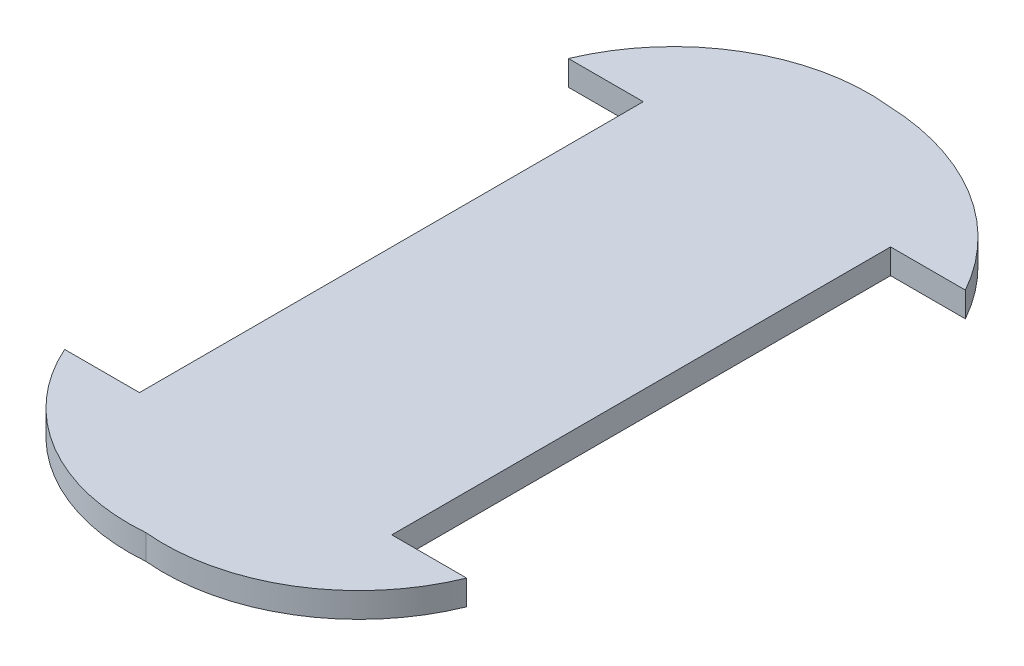
ISO-10303-21;
HEADER;
FILE_DESCRIPTION(('STEP AP214'),'2;1');
FILE_NAME('part.step','',(''),(''),'','','');
FILE_SCHEMA(('AUTOMOTIVE_DESIGN { 1 0 10303 214 1 1 1 1 }'));
ENDSEC;
DATA;
#1=APPLICATION_CONTEXT('core data for automotive mechanical design processes');
#2=APPLICATION_PROTOCOL_DEFINITION('international standard','automotive_design',2000,#1);
#3=PRODUCT_CONTEXT('',#1,'mechanical');
#4=PRODUCT('Part','Part','',(#3));
#5=PRODUCT_RELATED_PRODUCT_CATEGORY('part','',(#4));
#6=PRODUCT_DEFINITION_FORMATION('','',#4);
#7=PRODUCT_DEFINITION_CONTEXT('part definition',#1,'design');
#8=PRODUCT_DEFINITION('design','',#6,#7);
#9=PRODUCT_DEFINITION_SHAPE('','',#8);
#10=(LENGTH_UNIT() NAMED_UNIT(*) SI_UNIT(.MILLI.,.METRE.));
#11=(NAMED_UNIT(*) PLANE_ANGLE_UNIT() SI_UNIT($,.RADIAN.));
#12=(NAMED_UNIT(*) SI_UNIT($,.STERADIAN.) SOLID_ANGLE_UNIT());
#13=UNCERTAINTY_MEASURE_WITH_UNIT(LENGTH_MEASURE(1.E-05),#10,'distance_accuracy_value','');
#14=(GEOMETRIC_REPRESENTATION_CONTEXT(3) GLOBAL_UNCERTAINTY_ASSIGNED_CONTEXT((#13)) GLOBAL_UNIT_ASSIGNED_CONTEXT((#10,
#11,#12)) REPRESENTATION_CONTEXT('',''));
#15=CARTESIAN_POINT('',(0.,0.,0.));
#16=DIRECTION('',(0.,0.,1.));
#17=DIRECTION('',(1.,0.,0.));
#18=AXIS2_PLACEMENT_3D('',#15,#16,#17);
#19=CARTESIAN_POINT('',(50.,10.,-100.));
#20=DIRECTION('',(0.,0.,-1.));
#21=DIRECTION('',(-1.,0.,0.));
#22=AXIS2_PLACEMENT_3D('',#19,#20,#21);
#23=PLANE('',#22);
#24=DIRECTION('',(1.,0.,0.));
#25=VECTOR('',#24,1.);
#26=CARTESIAN_POINT('',(50.,0.,-100.));
#27=LINE('',#26,#25);
#28=CARTESIAN_POINT('',(50.,0.,-100.));
#29=VERTEX_POINT('',#28);
#30=CARTESIAN_POINT('',(80.,0.,-100.));
#31=VERTEX_POINT('',#30);
#32=EDGE_CURVE('E141',#29,#31,#27,.T.);
#33=ORIENTED_EDGE('',*,*,#32,.T.);
#34=DIRECTION('',(0.,-1.,0.));
#35=VECTOR('',#34,1.);
#36=CARTESIAN_POINT('',(80.,10.,-100.));
#37=LINE('',#36,#35);
#38=CARTESIAN_POINT('',(80.,10.,-100.));
#39=VERTEX_POINT('',#38);
#40=EDGE_CURVE('E11',#39,#31,#37,.T.);
#41=ORIENTED_EDGE('',*,*,#40,.F.);
#42=DIRECTION('',(1.,0.,0.));
#43=VECTOR('',#42,1.);
#44=CARTESIAN_POINT('',(50.,10.,-100.));
#45=LINE('',#44,#43);
#46=CARTESIAN_POINT('',(50.,10.,-100.));
#47=VERTEX_POINT('',#46);
#48=EDGE_CURVE('E159',#47,#39,#45,.T.);
#49=ORIENTED_EDGE('',*,*,#48,.F.);
#50=DIRECTION('',(0.,-1.,0.));
#51=VECTOR('',#50,1.);
#52=CARTESIAN_POINT('',(50.,10.,-100.));
#53=LINE('',#52,#51);
#54=EDGE_CURVE('E137',#47,#29,#53,.T.);
#55=ORIENTED_EDGE('',*,*,#54,.T.);
#56=EDGE_LOOP('',(#33,#41,#49,#55));
#57=FACE_BOUND('',#56,.T.);
#58=ADVANCED_FACE('F33',(#57),#23,.F.);
#59=CARTESIAN_POINT('',(-2.78424386794476,10.,-53.7669049189763));
#60=DIRECTION('',(0.,-1.,0.));
#61=DIRECTION('',(0.,0.,-1.));
#62=AXIS2_PLACEMENT_3D('',#59,#60,#61);
#63=CYLINDRICAL_SURFACE('',#62,94.8194606268056);
#64=CARTESIAN_POINT('',(-2.78424386794476,0.,-53.7669049189763));
#65=DIRECTION('',(0.,1.,0.));
#66=DIRECTION('',(0.,0.,-1.));
#67=AXIS2_PLACEMENT_3D('',#64,#65,#66);
#68=CIRCLE('',#67,94.8194606268056);
#69=CARTESIAN_POINT('',(0.795654444108916,0.,-148.518762112562));
#70=VERTEX_POINT('',#69);
#71=EDGE_CURVE('E144',#31,#70,#68,.T.);
#72=ORIENTED_EDGE('',*,*,#71,.T.);
#73=DIRECTION('',(0.,-1.,0.));
#74=VECTOR('',#73,1.);
#75=CARTESIAN_POINT('',(0.795654444108916,10.,-148.518762112562));
#76=LINE('',#75,#74);
#77=CARTESIAN_POINT('',(0.795654444108916,10.,-148.518762112562));
#78=VERTEX_POINT('',#77);
#79=EDGE_CURVE('E41',#78,#70,#76,.T.);
#80=ORIENTED_EDGE('',*,*,#79,.F.);
#81=CARTESIAN_POINT('',(-2.78424386794476,10.,-53.7669049189763));
#82=DIRECTION('',(0.,1.,0.));
#83=DIRECTION('',(0.,0.,-1.));
#84=AXIS2_PLACEMENT_3D('',#81,#82,#83);
#85=CIRCLE('',#84,94.8194606268056);
#86=EDGE_CURVE('E98',#39,#78,#85,.T.);
#87=ORIENTED_EDGE('',*,*,#86,.F.);
#88=ORIENTED_EDGE('',*,*,#40,.T.);
#89=EDGE_LOOP('',(#72,#80,#87,#88));
#90=FACE_BOUND('',#89,.T.);
#91=ADVANCED_FACE('F208',(#90),#63,.T.);
#92=CARTESIAN_POINT('',(-7.68306068778015,10.,-70.5939807091649));
#93=DIRECTION('',(0.,-1.,0.));
#94=DIRECTION('',(0.,0.,-1.));
#95=AXIS2_PLACEMENT_3D('',#92,#93,#94);
#96=CYLINDRICAL_SURFACE('',#95,78.384693448753);
#97=CARTESIAN_POINT('',(-7.68306068778015,0.,-70.5939807091649));
#98=DIRECTION('',(0.,1.,0.));
#99=DIRECTION('',(0.,0.,-1.));
#100=AXIS2_PLACEMENT_3D('',#97,#98,#99);
#101=CIRCLE('',#100,78.384693448753);
#102=CARTESIAN_POINT('',(-80.,0.,-100.833366542341));
#103=VERTEX_POINT('',#102);
#104=EDGE_CURVE('E146',#70,#103,#101,.T.);
#105=ORIENTED_EDGE('',*,*,#104,.T.);
#106=DIRECTION('',(0.,-1.,0.));
#107=VECTOR('',#106,1.);
#108=CARTESIAN_POINT('',(-80.,10.,-100.833366542341));
#109=LINE('',#108,#107);
#110=CARTESIAN_POINT('',(-80.,10.,-100.833366542341));
#111=VERTEX_POINT('',#110);
#112=EDGE_CURVE('E172',#111,#103,#109,.T.);
#113=ORIENTED_EDGE('',*,*,#112,.F.);
#114=CARTESIAN_POINT('',(-7.68306068778015,10.,-70.5939807091649));
#115=DIRECTION('',(0.,1.,0.));
#116=DIRECTION('',(0.,0.,-1.));
#117=AXIS2_PLACEMENT_3D('',#114,#115,#116);
#118=CIRCLE('',#117,78.384693448753);
#119=EDGE_CURVE('E180',#78,#111,#118,.T.);
#120=ORIENTED_EDGE('',*,*,#119,.F.);
#121=ORIENTED_EDGE('',*,*,#79,.T.);
#122=EDGE_LOOP('',(#105,#113,#120,#121));
#123=FACE_BOUND('',#122,.T.);
#124=ADVANCED_FACE('F178',(#123),#96,.T.);
#125=CARTESIAN_POINT('',(-50.,10.,-100.833366542341));
#126=DIRECTION('',(0.,0.,-1.));
#127=DIRECTION('',(-1.,0.,0.));
#128=AXIS2_PLACEMENT_3D('',#125,#126,#127);
#129=PLANE('',#128);
#130=DIRECTION('',(1.,0.,0.));
#131=VECTOR('',#130,1.);
#132=CARTESIAN_POINT('',(-50.,0.,-100.833366542341));
#133=LINE('',#132,#131);
#134=CARTESIAN_POINT('',(-50.,0.,-100.833366542341));
#135=VERTEX_POINT('',#134);
#136=EDGE_CURVE('E148',#103,#135,#133,.T.);
#137=ORIENTED_EDGE('',*,*,#136,.T.);
#138=DIRECTION('',(0.,-1.,0.));
#139=VECTOR('',#138,1.);
#140=CARTESIAN_POINT('',(-50.,10.,-100.833366542341));
#141=LINE('',#140,#139);
#142=CARTESIAN_POINT('',(-50.,10.,-100.833366542341));
#143=VERTEX_POINT('',#142);
#144=EDGE_CURVE('E169',#143,#135,#141,.T.);
#145=ORIENTED_EDGE('',*,*,#144,.F.);
#146=DIRECTION('',(1.,0.,0.));
#147=VECTOR('',#146,1.);
#148=CARTESIAN_POINT('',(-50.,10.,-100.833366542341));
#149=LINE('',#148,#147);
#150=EDGE_CURVE('E198',#111,#143,#149,.T.);
#151=ORIENTED_EDGE('',*,*,#150,.F.);
#152=ORIENTED_EDGE('',*,*,#112,.T.);
#153=EDGE_LOOP('',(#137,#145,#151,#152));
#154=FACE_BOUND('',#153,.T.);
#155=ADVANCED_FACE('F189',(#154),#129,.F.);
#156=CARTESIAN_POINT('',(-50.,10.,101.182229898701));
#157=DIRECTION('',(1.,0.,0.));
#158=DIRECTION('',(0.,0.,-1.));
#159=AXIS2_PLACEMENT_3D('',#156,#157,#158);
#160=PLANE('',#159);
#161=DIRECTION('',(0.,0.,1.));
#162=VECTOR('',#161,1.);
#163=CARTESIAN_POINT('',(-50.,0.,101.182229898701));
#164=LINE('',#163,#162);
#165=CARTESIAN_POINT('',(-50.,0.,101.182229898701));
#166=VERTEX_POINT('',#165);
#167=EDGE_CURVE('E150',#135,#166,#164,.T.);
#168=ORIENTED_EDGE('',*,*,#167,.T.);
#169=DIRECTION('',(0.,-1.,0.));
#170=VECTOR('',#169,1.);
#171=CARTESIAN_POINT('',(-50.,10.,101.182229898701));
#172=LINE('',#171,#170);
#173=CARTESIAN_POINT('',(-50.,10.,101.182229898701));
#174=VERTEX_POINT('',#173);
#175=EDGE_CURVE('E166',#174,#166,#172,.T.);
#176=ORIENTED_EDGE('',*,*,#175,.F.);
#177=DIRECTION('',(0.,0.,1.));
#178=VECTOR('',#177,1.);
#179=CARTESIAN_POINT('',(-50.,10.,101.182229898701));
#180=LINE('',#179,#178);
#181=EDGE_CURVE('E195',#143,#174,#180,.T.);
#182=ORIENTED_EDGE('',*,*,#181,.F.);
#183=ORIENTED_EDGE('',*,*,#144,.T.);
#184=EDGE_LOOP('',(#168,#176,#182,#183));
#185=FACE_BOUND('',#184,.T.);
#186=ADVANCED_FACE('F193',(#185),#160,.F.);
#187=CARTESIAN_POINT('',(-80.,10.,101.182229898701));
#188=DIRECTION('',(0.,0.,1.));
#189=DIRECTION('',(1.,0.,0.));
#190=AXIS2_PLACEMENT_3D('',#187,#188,#189);
#191=PLANE('',#190);
#192=DIRECTION('',(-1.,0.,0.));
#193=VECTOR('',#192,1.);
#194=CARTESIAN_POINT('',(-80.,0.,101.182229898701));
#195=LINE('',#194,#193);
#196=CARTESIAN_POINT('',(-80.,0.,101.182229898701));
#197=VERTEX_POINT('',#196);
#198=EDGE_CURVE('E152',#166,#197,#195,.T.);
#199=ORIENTED_EDGE('',*,*,#198,.T.);
#200=DIRECTION('',(0.,-1.,0.));
#201=VECTOR('',#200,1.);
#202=CARTESIAN_POINT('',(-80.,10.,101.182229898701));
#203=LINE('',#202,#201);
#204=CARTESIAN_POINT('',(-80.,10.,101.182229898701));
#205=VERTEX_POINT('',#204);
#206=EDGE_CURVE('E163',#205,#197,#203,.T.);
#207=ORIENTED_EDGE('',*,*,#206,.F.);
#208=DIRECTION('',(-1.,0.,0.));
#209=VECTOR('',#208,1.);
#210=CARTESIAN_POINT('',(-80.,10.,101.182229898701));
#211=LINE('',#210,#209);
#212=EDGE_CURVE('E197',#174,#205,#211,.T.);
#213=ORIENTED_EDGE('',*,*,#212,.F.);
#214=ORIENTED_EDGE('',*,*,#175,.T.);
#215=EDGE_LOOP('',(#199,#207,#213,#214));
#216=FACE_BOUND('',#215,.T.);
#217=ADVANCED_FACE('F220',(#216),#191,.F.);
#218=CARTESIAN_POINT('',(-6.57333167833926,10.,68.3775635833274));
#219=DIRECTION('',(0.,-1.,0.));
#220=DIRECTION('',(0.,0.,-1.));
#221=AXIS2_PLACEMENT_3D('',#218,#219,#220);
#222=CYLINDRICAL_SURFACE('',#221,80.42152543245);
#223=CARTESIAN_POINT('',(-6.57333167833926,0.,68.3775635833274));
#224=DIRECTION('',(0.,1.,0.));
#225=DIRECTION('',(0.,0.,-1.));
#226=AXIS2_PLACEMENT_3D('',#223,#224,#225);
#227=CIRCLE('',#226,80.42152543245);
#228=CARTESIAN_POINT('',(0.,0.,148.53));
#229=VERTEX_POINT('',#228);
#230=EDGE_CURVE('E154',#197,#229,#227,.T.);
#231=ORIENTED_EDGE('',*,*,#230,.T.);
#232=DIRECTION('',(0.,-1.,0.));
#233=VECTOR('',#232,1.);
#234=CARTESIAN_POINT('',(0.,10.,148.53));
#235=LINE('',#234,#233);
#236=CARTESIAN_POINT('',(0.,10.,148.53));
#237=VERTEX_POINT('',#236);
#238=EDGE_CURVE('E132',#237,#229,#235,.T.);
#239=ORIENTED_EDGE('',*,*,#238,.F.);
#240=CARTESIAN_POINT('',(-6.57333167833926,10.,68.3775635833274));
#241=DIRECTION('',(0.,1.,0.));
#242=DIRECTION('',(0.,0.,-1.));
#243=AXIS2_PLACEMENT_3D('',#240,#241,#242);
#244=CIRCLE('',#243,80.42152543245);
#245=EDGE_CURVE('E123',#205,#237,#244,.T.);
#246=ORIENTED_EDGE('',*,*,#245,.F.);
#247=ORIENTED_EDGE('',*,*,#206,.T.);
#248=EDGE_LOOP('',(#231,#239,#246,#247));
#249=FACE_BOUND('',#248,.T.);
#250=ADVANCED_FACE('F223',(#249),#222,.T.);
#251=CARTESIAN_POINT('',(7.38091459539411,10.,70.4935837138168));
#252=DIRECTION('',(0.,-1.,0.));
#253=DIRECTION('',(0.,0.,-1.));
#254=AXIS2_PLACEMENT_3D('',#251,#252,#253);
#255=CYLINDRICAL_SURFACE('',#254,78.384693448753);
#256=CARTESIAN_POINT('',(7.38091459539411,0.,70.4935837138168));
#257=DIRECTION('',(0.,1.,0.));
#258=DIRECTION('',(0.,0.,-1.));
#259=AXIS2_PLACEMENT_3D('',#256,#257,#258);
#260=CIRCLE('',#259,78.384693448753);
#261=CARTESIAN_POINT('',(80.,0.,100.));
#262=VERTEX_POINT('',#261);
#263=EDGE_CURVE('E131',#229,#262,#260,.T.);
#264=ORIENTED_EDGE('',*,*,#263,.T.);
#265=DIRECTION('',(0.,-1.,0.));
#266=VECTOR('',#265,1.);
#267=CARTESIAN_POINT('',(80.,10.,100.));
#268=LINE('',#267,#266);
#269=CARTESIAN_POINT('',(80.,10.,100.));
#270=VERTEX_POINT('',#269);
#271=EDGE_CURVE('E128',#270,#262,#268,.T.);
#272=ORIENTED_EDGE('',*,*,#271,.F.);
#273=CARTESIAN_POINT('',(7.38091459539411,10.,70.4935837138168));
#274=DIRECTION('',(0.,1.,0.));
#275=DIRECTION('',(0.,0.,-1.));
#276=AXIS2_PLACEMENT_3D('',#273,#274,#275);
#277=CIRCLE('',#276,78.384693448753);
#278=EDGE_CURVE('E117',#237,#270,#277,.T.);
#279=ORIENTED_EDGE('',*,*,#278,.F.);
#280=ORIENTED_EDGE('',*,*,#238,.T.);
#281=EDGE_LOOP('',(#264,#272,#279,#280));
#282=FACE_BOUND('',#281,.T.);
#283=ADVANCED_FACE('F129',(#282),#255,.T.);
#284=CARTESIAN_POINT('',(50.,10.,100.));
#285=DIRECTION('',(0.,0.,1.));
#286=DIRECTION('',(1.,0.,0.));
#287=AXIS2_PLACEMENT_3D('',#284,#285,#286);
#288=PLANE('',#287);
#289=DIRECTION('',(-1.,0.,0.));
#290=VECTOR('',#289,1.);
#291=CARTESIAN_POINT('',(50.,0.,100.));
#292=LINE('',#291,#290);
#293=CARTESIAN_POINT('',(50.,0.,100.));
#294=VERTEX_POINT('',#293);
#295=EDGE_CURVE('E84',#262,#294,#292,.T.);
#296=ORIENTED_EDGE('',*,*,#295,.T.);
#297=DIRECTION('',(0.,-1.,0.));
#298=VECTOR('',#297,1.);
#299=CARTESIAN_POINT('',(50.,10.,100.));
#300=LINE('',#299,#298);
#301=CARTESIAN_POINT('',(50.,10.,100.));
#302=VERTEX_POINT('',#301);
#303=EDGE_CURVE('E133',#302,#294,#300,.T.);
#304=ORIENTED_EDGE('',*,*,#303,.F.);
#305=DIRECTION('',(-1.,0.,0.));
#306=VECTOR('',#305,1.);
#307=CARTESIAN_POINT('',(50.,10.,100.));
#308=LINE('',#307,#306);
#309=EDGE_CURVE('E121',#270,#302,#308,.T.);
#310=ORIENTED_EDGE('',*,*,#309,.F.);
#311=ORIENTED_EDGE('',*,*,#271,.T.);
#312=EDGE_LOOP('',(#296,#304,#310,#311));
#313=FACE_BOUND('',#312,.T.);
#314=ADVANCED_FACE('F135',(#313),#288,.F.);
#315=CARTESIAN_POINT('',(50.,10.,-100.));
#316=DIRECTION('',(-1.,0.,0.));
#317=DIRECTION('',(0.,0.,1.));
#318=AXIS2_PLACEMENT_3D('',#315,#316,#317);
#319=PLANE('',#318);
#320=DIRECTION('',(0.,0.,-1.));
#321=VECTOR('',#320,1.);
#322=CARTESIAN_POINT('',(50.,0.,-100.));
#323=LINE('',#322,#321);
#324=EDGE_CURVE('E90',#294,#29,#323,.T.);
#325=ORIENTED_EDGE('',*,*,#324,.T.);
#326=ORIENTED_EDGE('',*,*,#54,.F.);
#327=DIRECTION('',(0.,0.,-1.));
#328=VECTOR('',#327,1.);
#329=CARTESIAN_POINT('',(50.,10.,-100.));
#330=LINE('',#329,#328);
#331=EDGE_CURVE('E49',#302,#47,#330,.T.);
#332=ORIENTED_EDGE('',*,*,#331,.F.);
#333=ORIENTED_EDGE('',*,*,#303,.T.);
#334=EDGE_LOOP('',(#325,#326,#332,#333));
#335=FACE_BOUND('',#334,.T.);
#336=ADVANCED_FACE('F232',(#335),#319,.F.);
#337=CARTESIAN_POINT('',(-2.78424386794476,10.,-53.7669049189763));
#338=DIRECTION('',(0.,-1.,0.));
#339=DIRECTION('',(0.,0.,-1.));
#340=AXIS2_PLACEMENT_3D('',#337,#338,#339);
#341=PLANE('',#340);
#342=ORIENTED_EDGE('',*,*,#48,.T.);
#343=ORIENTED_EDGE('',*,*,#86,.T.);
#344=ORIENTED_EDGE('',*,*,#119,.T.);
#345=ORIENTED_EDGE('',*,*,#150,.T.);
#346=ORIENTED_EDGE('',*,*,#181,.T.);
#347=ORIENTED_EDGE('',*,*,#212,.T.);
#348=ORIENTED_EDGE('',*,*,#245,.T.);
#349=ORIENTED_EDGE('',*,*,#278,.T.);
#350=ORIENTED_EDGE('',*,*,#309,.T.);
#351=ORIENTED_EDGE('',*,*,#331,.T.);
#352=EDGE_LOOP('',(#342,#343,#344,#345,#346,#347,#348,#349,#350,#351));
#353=FACE_BOUND('',#352,.T.);
#354=ADVANCED_FACE('F119',(#353),#341,.F.);
#355=CARTESIAN_POINT('',(-2.78424386794476,0.,-53.7669049189763));
#356=DIRECTION('',(0.,-1.,0.));
#357=DIRECTION('',(0.,0.,-1.));
#358=AXIS2_PLACEMENT_3D('',#355,#356,#357);
#359=PLANE('',#358);
#360=ORIENTED_EDGE('',*,*,#32,.F.);
#361=ORIENTED_EDGE('',*,*,#324,.F.);
#362=ORIENTED_EDGE('',*,*,#295,.F.);
#363=ORIENTED_EDGE('',*,*,#263,.F.);
#364=ORIENTED_EDGE('',*,*,#230,.F.);
#365=ORIENTED_EDGE('',*,*,#198,.F.);
#366=ORIENTED_EDGE('',*,*,#167,.F.);
#367=ORIENTED_EDGE('',*,*,#136,.F.);
#368=ORIENTED_EDGE('',*,*,#104,.F.);
#369=ORIENTED_EDGE('',*,*,#71,.F.);
#370=EDGE_LOOP('',(#360,#361,#362,#363,#364,#365,#366,#367,#368,#369));
#371=FACE_BOUND('',#370,.T.);
#372=ADVANCED_FACE('F184',(#371),#359,.T.);
#373=CLOSED_SHELL('',(#58,#91,#124,#155,#186,#217,#250,#283,#314,#336,#354,#372));
#374=MANIFOLD_SOLID_BREP('B2',#373);
#375=ADVANCED_BREP_SHAPE_REPRESENTATION('',(#18,#374),#14);
#376=SHAPE_DEFINITION_REPRESENTATION(#9,#375);
ENDSEC;
END-ISO-10303-21;
